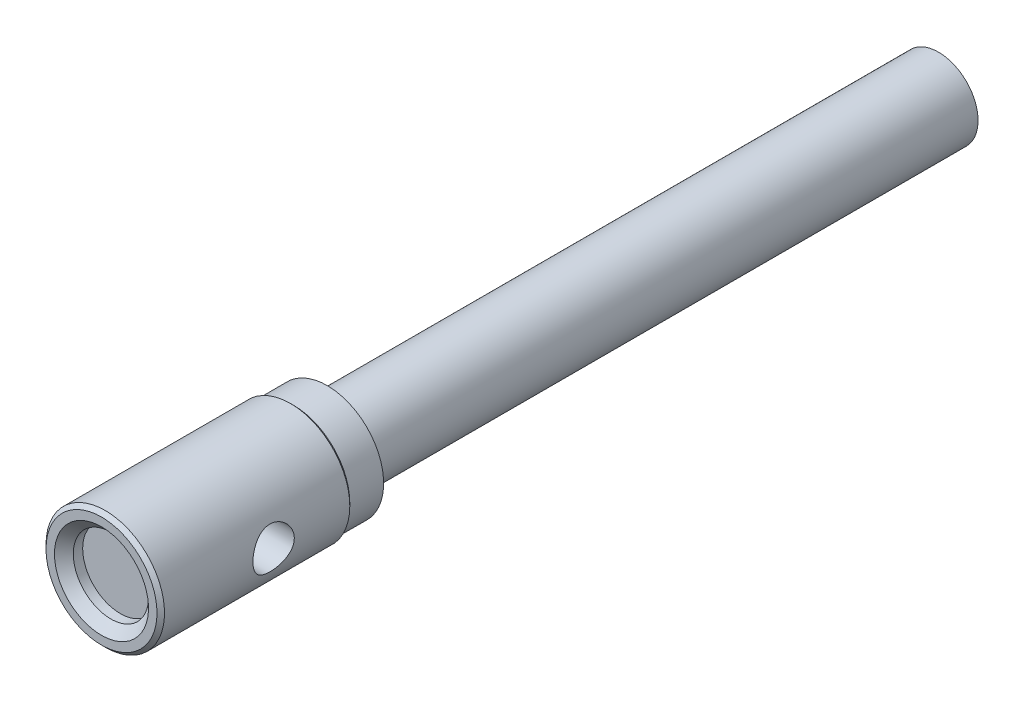
ISO-10303-21;
HEADER;
FILE_DESCRIPTION(('STEP AP214'),'2;1');
FILE_NAME('part.step','',(''),(''),'','','');
FILE_SCHEMA(('AUTOMOTIVE_DESIGN { 1 0 10303 214 1 1 1 1 }'));
ENDSEC;
DATA;
#1=APPLICATION_CONTEXT('core data for automotive mechanical design processes');
#2=APPLICATION_PROTOCOL_DEFINITION('international standard','automotive_design',2000,#1);
#3=PRODUCT_CONTEXT('',#1,'mechanical');
#4=PRODUCT('Part','Part','',(#3));
#5=PRODUCT_RELATED_PRODUCT_CATEGORY('part','',(#4));
#6=PRODUCT_DEFINITION_FORMATION('','',#4);
#7=PRODUCT_DEFINITION_CONTEXT('part definition',#1,'design');
#8=PRODUCT_DEFINITION('design','',#6,#7);
#9=PRODUCT_DEFINITION_SHAPE('','',#8);
#10=(LENGTH_UNIT() NAMED_UNIT(*) SI_UNIT(.MILLI.,.METRE.));
#11=(NAMED_UNIT(*) PLANE_ANGLE_UNIT() SI_UNIT($,.RADIAN.));
#12=(NAMED_UNIT(*) SI_UNIT($,.STERADIAN.) SOLID_ANGLE_UNIT());
#13=UNCERTAINTY_MEASURE_WITH_UNIT(LENGTH_MEASURE(1.E-05),#10,'distance_accuracy_value','');
#14=(GEOMETRIC_REPRESENTATION_CONTEXT(3) GLOBAL_UNCERTAINTY_ASSIGNED_CONTEXT((#13)) GLOBAL_UNIT_ASSIGNED_CONTEXT((#10,
#11,#12)) REPRESENTATION_CONTEXT('',''));
#15=CARTESIAN_POINT('',(0.,0.,0.));
#16=DIRECTION('',(0.,0.,1.));
#17=DIRECTION('',(1.,0.,0.));
#18=AXIS2_PLACEMENT_3D('',#15,#16,#17);
#19=CARTESIAN_POINT('',(0.,0.,11.));
#20=DIRECTION('',(0.,0.,-1.));
#21=DIRECTION('',(-1.,0.,0.));
#22=AXIS2_PLACEMENT_3D('',#19,#20,#21);
#23=PLANE('',#22);
#24=CARTESIAN_POINT('',(0.,0.,11.));
#25=DIRECTION('',(0.,0.,-1.));
#26=DIRECTION('',(-1.,0.,0.));
#27=AXIS2_PLACEMENT_3D('',#24,#25,#26);
#28=CIRCLE('',#27,2.);
#29=CARTESIAN_POINT('',(-1.99999999999999,0.,11.));
#30=VERTEX_POINT('',#29);
#31=EDGE_CURVE('E131',#30,#30,#28,.T.);
#32=ORIENTED_EDGE('',*,*,#31,.F.);
#33=EDGE_LOOP('',(#32));
#34=FACE_BOUND('',#33,.T.);
#35=ADVANCED_FACE('F31',(#34),#23,.F.);
#36=CARTESIAN_POINT('',(2.1,0.,-32.5));
#37=DIRECTION('',(0.,0.,1.));
#38=DIRECTION('',(1.,0.,0.));
#39=AXIS2_PLACEMENT_3D('',#36,#37,#38);
#40=PLANE('',#39);
#41=CARTESIAN_POINT('',(0.,0.,-32.5));
#42=DIRECTION('',(0.,0.,-1.));
#43=DIRECTION('',(-1.,0.,0.));
#44=AXIS2_PLACEMENT_3D('',#41,#42,#43);
#45=CIRCLE('',#44,2.1);
#46=CARTESIAN_POINT('',(-2.1,0.,-32.5));
#47=VERTEX_POINT('',#46);
#48=EDGE_CURVE('E121',#47,#47,#45,.T.);
#49=ORIENTED_EDGE('',*,*,#48,.T.);
#50=EDGE_LOOP('',(#49));
#51=FACE_BOUND('',#50,.T.);
#52=ADVANCED_FACE('F91',(#51),#40,.F.);
#53=CARTESIAN_POINT('',(0.,0.,-32.5));
#54=DIRECTION('',(0.,0.,-1.));
#55=DIRECTION('',(-1.,0.,0.));
#56=AXIS2_PLACEMENT_3D('',#53,#54,#55);
#57=CYLINDRICAL_SURFACE('',#56,2.1);
#58=ORIENTED_EDGE('',*,*,#48,.F.);
#59=EDGE_LOOP('',(#58));
#60=FACE_BOUND('',#59,.T.);
#61=CARTESIAN_POINT('',(0.,0.,0.));
#62=DIRECTION('',(0.,0.,-1.));
#63=DIRECTION('',(-1.,0.,0.));
#64=AXIS2_PLACEMENT_3D('',#61,#62,#63);
#65=CIRCLE('',#64,2.1);
#66=CARTESIAN_POINT('',(-2.09999999999999,0.,0.));
#67=VERTEX_POINT('',#66);
#68=EDGE_CURVE('E123',#67,#67,#65,.T.);
#69=ORIENTED_EDGE('',*,*,#68,.T.);
#70=EDGE_LOOP('',(#69));
#71=FACE_BOUND('',#70,.T.);
#72=ADVANCED_FACE('F97',(#60,#71),#57,.T.);
#73=CARTESIAN_POINT('',(3.,0.,0.));
#74=DIRECTION('',(0.,0.,1.));
#75=DIRECTION('',(1.,0.,0.));
#76=AXIS2_PLACEMENT_3D('',#73,#74,#75);
#77=PLANE('',#76);
#78=ORIENTED_EDGE('',*,*,#68,.F.);
#79=EDGE_LOOP('',(#78));
#80=FACE_BOUND('',#79,.T.);
#81=CARTESIAN_POINT('',(0.,0.,0.));
#82=DIRECTION('',(0.,0.,-1.));
#83=DIRECTION('',(-1.,0.,0.));
#84=AXIS2_PLACEMENT_3D('',#81,#82,#83);
#85=CIRCLE('',#84,3.);
#86=CARTESIAN_POINT('',(-2.99999999999999,0.,0.));
#87=VERTEX_POINT('',#86);
#88=EDGE_CURVE('E126',#87,#87,#85,.T.);
#89=ORIENTED_EDGE('',*,*,#88,.T.);
#90=EDGE_LOOP('',(#89));
#91=FACE_BOUND('',#90,.T.);
#92=ADVANCED_FACE('F136',(#80,#91),#77,.F.);
#93=CARTESIAN_POINT('',(0.,0.,-32.5));
#94=DIRECTION('',(0.,0.,-1.));
#95=DIRECTION('',(-1.,0.,0.));
#96=AXIS2_PLACEMENT_3D('',#93,#94,#95);
#97=CYLINDRICAL_SURFACE('',#96,3.);
#98=CARTESIAN_POINT('',(0.,0.,1.8));
#99=DIRECTION('',(0.,0.,1.));
#100=DIRECTION('',(1.,0.,0.));
#101=AXIS2_PLACEMENT_3D('',#98,#99,#100);
#102=CIRCLE('',#101,3.);
#103=CARTESIAN_POINT('',(3.,0.,1.8));
#104=VERTEX_POINT('',#103);
#105=EDGE_CURVE('E38',#104,#104,#102,.F.);
#106=ORIENTED_EDGE('',*,*,#105,.T.);
#107=EDGE_LOOP('',(#106));
#108=FACE_BOUND('',#107,.T.);
#109=ORIENTED_EDGE('',*,*,#88,.F.);
#110=EDGE_LOOP('',(#109));
#111=FACE_BOUND('',#110,.T.);
#112=ADVANCED_FACE('F88',(#108,#111),#97,.T.);
#113=CARTESIAN_POINT('',(0.,0.,-32.5));
#114=DIRECTION('',(0.,0.,-1.));
#115=DIRECTION('',(-1.,0.,0.));
#116=AXIS2_PLACEMENT_3D('',#113,#114,#115);
#117=CYLINDRICAL_SURFACE('',#116,3.15);
#118=CARTESIAN_POINT('',(0.,0.,1.95));
#119=DIRECTION('',(0.,0.,1.));
#120=DIRECTION('',(1.,0.,0.));
#121=AXIS2_PLACEMENT_3D('',#118,#119,#120);
#122=CIRCLE('',#121,3.15);
#123=CARTESIAN_POINT('',(3.15,0.,1.95));
#124=VERTEX_POINT('',#123);
#125=EDGE_CURVE('E10',#124,#124,#122,.T.);
#126=ORIENTED_EDGE('',*,*,#125,.T.);
#127=EDGE_LOOP('',(#126));
#128=FACE_BOUND('',#127,.T.);
#129=CARTESIAN_POINT('',(0.,0.,11.8));
#130=DIRECTION('',(0.,0.,-1.));
#131=DIRECTION('',(-1.,0.,0.));
#132=AXIS2_PLACEMENT_3D('',#129,#130,#131);
#133=CIRCLE('',#132,3.15);
#134=CARTESIAN_POINT('',(-3.14999999999999,0.,11.8));
#135=VERTEX_POINT('',#134);
#136=EDGE_CURVE('E46',#135,#135,#133,.T.);
#137=ORIENTED_EDGE('',*,*,#136,.T.);
#138=EDGE_LOOP('',(#137));
#139=FACE_BOUND('',#138,.T.);
#140=CARTESIAN_POINT('',(-3.14999999999999,0.,4.9));
#141=CARTESIAN_POINT('',(-3.15000062656625,0.0598545161133453,4.89999910423972));
#142=CARTESIAN_POINT('',(-3.14827860290213,0.119702639683627,4.90490100252035));
#143=CARTESIAN_POINT('',(-3.14157958504155,0.237626306593505,4.92431203783043));
#144=CARTESIAN_POINT('',(-3.13660256089176,0.295701833616074,4.93882126326893));
#145=CARTESIAN_POINT('',(-3.12393195053776,0.408363240048861,4.97688212223573));
#146=CARTESIAN_POINT('',(-3.11624316965986,0.462955091869647,5.0004177670456));
#147=CARTESIAN_POINT('',(-3.09892673820325,0.567415238871868,5.05578775244425));
#148=CARTESIAN_POINT('',(-3.08929864969265,0.617282463397579,5.08762396793591));
#149=CARTESIAN_POINT('',(-3.06870531573153,0.712751350462781,5.15994513875445));
#150=CARTESIAN_POINT('',(-3.05770582603618,0.758151333451825,5.2006865038018));
#151=CARTESIAN_POINT('',(-3.03579023232722,0.841631710777947,5.28911675006506));
#152=CARTESIAN_POINT('',(-3.02487414981114,0.87971027538392,5.33680736277993));
#153=CARTESIAN_POINT('',(-3.00397673772314,0.948665640724425,5.43965464143032));
#154=CARTESIAN_POINT('',(-2.99403667193371,0.979271968310073,5.49500185417965));
#155=CARTESIAN_POINT('',(-2.97674190512394,1.03065419586177,5.61046093760303));
#156=CARTESIAN_POINT('',(-2.96938632680995,1.05143343242372,5.67057118297784));
#157=CARTESIAN_POINT('',(-2.95845594752781,1.0818002935028,5.79154473877334));
#158=CARTESIAN_POINT('',(-2.95475299257686,1.09176859474416,5.85230055162693));
#159=CARTESIAN_POINT('',(-2.95116942479476,1.10142095433558,5.97472660729035));
#160=CARTESIAN_POINT('',(-2.95128749105079,1.10110856668092,6.03639652672798));
#161=CARTESIAN_POINT('',(-2.95522098002829,1.090502302001,6.15557021187301));
#162=CARTESIAN_POINT('',(-2.95884829617291,1.08071622649996,6.21312648380761));
#163=CARTESIAN_POINT('',(-2.96908200122875,1.0522728492418,6.3257219207364));
#164=CARTESIAN_POINT('',(-2.97568877972427,1.03361438734442,6.38076075552221));
#165=CARTESIAN_POINT('',(-2.99126318398664,0.987643714746534,6.48786846010328));
#166=CARTESIAN_POINT('',(-3.00026948896013,0.960188077408949,6.53986990183929));
#167=CARTESIAN_POINT('',(-3.0196131785397,0.897502065832835,6.63868316573245));
#168=CARTESIAN_POINT('',(-3.02995097638792,0.86226927544358,6.68549336830731));
#169=CARTESIAN_POINT('',(-3.05152104436138,0.782632851617404,6.77543380555815));
#170=CARTESIAN_POINT('',(-3.06277051978743,0.737817562456753,6.81819622008191));
#171=CARTESIAN_POINT('',(-3.08437832435996,0.64151600388609,6.89569960896031));
#172=CARTESIAN_POINT('',(-3.09473655045202,0.590028964747469,6.93043965647527));
#173=CARTESIAN_POINT('',(-3.11355477418329,0.481007517863014,6.99124745241965));
#174=CARTESIAN_POINT('',(-3.12199089830337,0.4234088477472,7.01720788811906));
#175=CARTESIAN_POINT('',(-3.13583989764418,0.304295581027896,7.05895353796206));
#176=CARTESIAN_POINT('',(-3.14125393003361,0.242782493332131,7.07474264709682));
#177=CARTESIAN_POINT('',(-3.14825269486376,0.120693730416341,7.09502550652171));
#178=CARTESIAN_POINT('',(-3.15000556518867,0.0602100549662604,7.10001561625123));
#179=CARTESIAN_POINT('',(-3.1499944119144,-0.0607479662730148,7.09998431812019));
#180=CARTESIAN_POINT('',(-3.14823104839565,-0.121222311682388,7.09496478930605));
#181=CARTESIAN_POINT('',(-3.14149668523958,-0.238400354931432,7.07544420728632));
#182=CARTESIAN_POINT('',(-3.13663136424965,-0.295162742601184,7.06125532993516));
#183=CARTESIAN_POINT('',(-3.12428791644542,-0.405472513213696,7.02419671666653));
#184=CARTESIAN_POINT('',(-3.11680945172395,-0.459019479318499,7.00132585804384));
#185=CARTESIAN_POINT('',(-3.09973442016246,-0.563029674755728,6.94685742880978));
#186=CARTESIAN_POINT('',(-3.09008506774048,-0.613366922398644,6.91503632343342));
#187=CARTESIAN_POINT('',(-3.06975327042955,-0.70814420139711,6.84382931987137));
#188=CARTESIAN_POINT('',(-3.05907048438502,-0.752582273761962,6.80444091932127));
#189=CARTESIAN_POINT('',(-3.03719376097003,-0.836620969871215,6.71688802043494));
#190=CARTESIAN_POINT('',(-3.02600102513227,-0.875867758663472,6.66838273671123));
#191=CARTESIAN_POINT('',(-3.00490480670685,-0.945718047111593,6.5652400387616));
#192=CARTESIAN_POINT('',(-2.99500136750512,-0.976321255944126,6.51060241829247));
#193=CARTESIAN_POINT('',(-2.97768561084442,-1.02792679703435,6.39658540267257));
#194=CARTESIAN_POINT('',(-2.97027307046783,-1.04892998848553,6.33720643242761));
#195=CARTESIAN_POINT('',(-2.95892652729931,-1.08052818769068,6.21543077257845));
#196=CARTESIAN_POINT('',(-2.95499075059248,-1.09112850350811,6.15303563904198));
#197=CARTESIAN_POINT('',(-2.95125796496875,-1.10118223019238,6.03077416838599));
#198=CARTESIAN_POINT('',(-2.95124074917837,-1.10122872179722,5.97096283156171));
#199=CARTESIAN_POINT('',(-2.95479511846875,-1.09165529933772,5.85223312453418));
#200=CARTESIAN_POINT('',(-2.95836644798005,-1.08203607364767,5.79331469104333));
#201=CARTESIAN_POINT('',(-2.96852404653166,-1.05384065152559,5.67939757509265));
#202=CARTESIAN_POINT('',(-2.97503937024913,-1.03547470392346,5.62434001608752));
#203=CARTESIAN_POINT('',(-2.99031875450277,-0.990482463449925,5.51804844197044));
#204=CARTESIAN_POINT('',(-2.9990833427798,-0.96385423170683,5.46681532782765));
#205=CARTESIAN_POINT('',(-3.01838743083872,-0.901634293925672,5.36701149889824));
#206=CARTESIAN_POINT('',(-3.02899103546646,-0.865679820732345,5.31867944479558));
#207=CARTESIAN_POINT('',(-3.05052869673277,-0.786421817964849,5.22854384267475));
#208=CARTESIAN_POINT('',(-3.06146285028218,-0.743116115630232,5.18674223185694));
#209=CARTESIAN_POINT('',(-3.08301179853969,-0.648083142472834,5.10897740575008));
#210=CARTESIAN_POINT('',(-3.09359093951059,-0.596067612540762,5.0733552219445));
#211=CARTESIAN_POINT('',(-3.1127125057939,-0.486428367368266,5.01138958513266));
#212=CARTESIAN_POINT('',(-3.12125521333987,-0.428805430830662,4.98504484610417));
#213=CARTESIAN_POINT('',(-3.13523967981924,-0.310296928997333,4.94282379630589));
#214=CARTESIAN_POINT('',(-3.14071886710978,-0.249461152258471,4.92682074213998));
#215=CARTESIAN_POINT('',(-3.14809807501834,-0.125747420152497,4.90541115924654));
#216=CARTESIAN_POINT('',(-3.14999934186527,-0.0628701836137011,4.90000094089163));
#217=CARTESIAN_POINT('',(-3.14999999999999,0.,4.9));
#218=B_SPLINE_CURVE_WITH_KNOTS('',3,(#140,#141,#142,#143,#144,#145,#146,#147,#148,#149,#150,
#151,#152,#153,#154,#155,#156,#157,#158,#159,#160,#161,#162,#163,#164,#165,#166,#167,#168,#169,
#170,#171,#172,#173,#174,#175,#176,#177,#178,#179,#180,#181,#182,#183,#184,#185,#186,#187,#188,
#189,#190,#191,#192,#193,#194,#195,#196,#197,#198,#199,#200,#201,#202,#203,#204,#205,#206,#207,
#208,#209,#210,#211,#212,#213,#214,#215,#216,#217),.UNSPECIFIED.,.T.,.F.,(4,2,2,2,2,2,2,2,2,2,2,
2,2,2,2,2,2,2,2,2,2,2,2,2,2,2,2,2,2,2,2,2,2,2,2,2,2,2,4),(0.,0.179331982868924,
0.358665616019064,0.537683047375237,0.716740949624888,0.901863506430727,1.08703226814633,
1.27814609872312,1.46919499368056,1.6532732495753,1.83728787098142,2.01195573119549,
2.18664643700608,2.36434404870121,2.5420969441235,2.73009915891897,2.91812308312213,
3.10836851011476,3.29854104145991,3.47976856850465,3.66096207804949,3.83629036546456,
4.01164133307993,4.19183432776892,4.37208701182706,4.56136916730426,4.75065769064192,
4.9399292694969,5.12910422230741,5.30764554483329,5.48617415288157,5.66061275020245,
5.83509231321367,6.01778067151487,6.20052312027806,6.39136786323447,6.58218614122296,
6.77061910498604,6.95898642332553),.UNSPECIFIED.);
#219=CARTESIAN_POINT('',(-3.14999999999999,0.,4.9));
#220=VERTEX_POINT('',#219);
#221=EDGE_CURVE('E57',#220,#220,#218,.T.);
#222=ORIENTED_EDGE('',*,*,#221,.T.);
#223=EDGE_LOOP('',(#222));
#224=FACE_BOUND('',#223,.T.);
#225=CARTESIAN_POINT('',(3.15,0.,4.9));
#226=CARTESIAN_POINT('',(3.15000062656626,-0.0598545161133453,4.89999910423972));
#227=CARTESIAN_POINT('',(3.14827860290214,-0.119702639683627,4.90490100252035));
#228=CARTESIAN_POINT('',(3.14157958504156,-0.237626306593505,4.92431203783043));
#229=CARTESIAN_POINT('',(3.13660256089177,-0.295701833616074,4.93882126326893));
#230=CARTESIAN_POINT('',(3.12393195053777,-0.408363240048861,4.97688212223573));
#231=CARTESIAN_POINT('',(3.11624316965987,-0.462955091869647,5.0004177670456));
#232=CARTESIAN_POINT('',(3.09892673820326,-0.567415238871868,5.05578775244425));
#233=CARTESIAN_POINT('',(3.08929864969266,-0.617282463397579,5.08762396793591));
#234=CARTESIAN_POINT('',(3.06870531573154,-0.712751350462781,5.15994513875445));
#235=CARTESIAN_POINT('',(3.05770582603619,-0.758151333451825,5.2006865038018));
#236=CARTESIAN_POINT('',(3.03579023232723,-0.841631710777947,5.28911675006506));
#237=CARTESIAN_POINT('',(3.02487414981115,-0.87971027538392,5.33680736277993));
#238=CARTESIAN_POINT('',(3.00397673772315,-0.948665640724425,5.43965464143032));
#239=CARTESIAN_POINT('',(2.99403667193372,-0.979271968310073,5.49500185417965));
#240=CARTESIAN_POINT('',(2.97674190512395,-1.03065419586177,5.61046093760303));
#241=CARTESIAN_POINT('',(2.96938632680996,-1.05143343242372,5.67057118297784));
#242=CARTESIAN_POINT('',(2.95845594752782,-1.0818002935028,5.79154473877334));
#243=CARTESIAN_POINT('',(2.95475299257687,-1.09176859474416,5.85230055162693));
#244=CARTESIAN_POINT('',(2.95116942479477,-1.10142095433558,5.97472660729035));
#245=CARTESIAN_POINT('',(2.9512874910508,-1.10110856668092,6.03639652672798));
#246=CARTESIAN_POINT('',(2.9552209800283,-1.090502302001,6.15557021187301));
#247=CARTESIAN_POINT('',(2.95884829617292,-1.08071622649997,6.21312648380761));
#248=CARTESIAN_POINT('',(2.96908200122876,-1.0522728492418,6.3257219207364));
#249=CARTESIAN_POINT('',(2.97568877972428,-1.03361438734442,6.38076075552221));
#250=CARTESIAN_POINT('',(2.99126318398665,-0.987643714746534,6.48786846010328));
#251=CARTESIAN_POINT('',(3.00026948896013,-0.96018807740895,6.53986990183929));
#252=CARTESIAN_POINT('',(3.01961317853971,-0.897502065832836,6.63868316573245));
#253=CARTESIAN_POINT('',(3.02995097638793,-0.862269275443581,6.68549336830731));
#254=CARTESIAN_POINT('',(3.05152104436138,-0.782632851617404,6.77543380555815));
#255=CARTESIAN_POINT('',(3.06277051978744,-0.737817562456752,6.81819622008191));
#256=CARTESIAN_POINT('',(3.08437832435997,-0.64151600388609,6.89569960896031));
#257=CARTESIAN_POINT('',(3.09473655045203,-0.590028964747469,6.93043965647527));
#258=CARTESIAN_POINT('',(3.1135547741833,-0.481007517863014,6.99124745241965));
#259=CARTESIAN_POINT('',(3.12199089830338,-0.4234088477472,7.01720788811906));
#260=CARTESIAN_POINT('',(3.13583989764419,-0.304295581027896,7.05895353796206));
#261=CARTESIAN_POINT('',(3.14125393003362,-0.242782493332131,7.07474264709682));
#262=CARTESIAN_POINT('',(3.14825269486377,-0.120693730416341,7.09502550652171));
#263=CARTESIAN_POINT('',(3.15000556518868,-0.0602100549662607,7.10001561625123));
#264=CARTESIAN_POINT('',(3.14999441191441,0.0607479662730145,7.09998431812019));
#265=CARTESIAN_POINT('',(3.14823104839566,0.121222311682388,7.09496478930605));
#266=CARTESIAN_POINT('',(3.14149668523959,0.238400354931432,7.07544420728632));
#267=CARTESIAN_POINT('',(3.13663136424966,0.295162742601184,7.06125532993516));
#268=CARTESIAN_POINT('',(3.12428791644543,0.405472513213695,7.02419671666653));
#269=CARTESIAN_POINT('',(3.11680945172396,0.459019479318499,7.00132585804384));
#270=CARTESIAN_POINT('',(3.09973442016247,0.563029674755727,6.94685742880978));
#271=CARTESIAN_POINT('',(3.09008506774048,0.613366922398643,6.91503632343343));
#272=CARTESIAN_POINT('',(3.06975327042956,0.708144201397109,6.84382931987137));
#273=CARTESIAN_POINT('',(3.05907048438503,0.752582273761962,6.80444091932127));
#274=CARTESIAN_POINT('',(3.03719376097003,0.836620969871215,6.71688802043494));
#275=CARTESIAN_POINT('',(3.02600102513228,0.875867758663472,6.66838273671123));
#276=CARTESIAN_POINT('',(3.00490480670685,0.945718047111593,6.5652400387616));
#277=CARTESIAN_POINT('',(2.99500136750512,0.976321255944126,6.51060241829247));
#278=CARTESIAN_POINT('',(2.97768561084442,1.02792679703435,6.39658540267257));
#279=CARTESIAN_POINT('',(2.97027307046783,1.04892998848553,6.33720643242761));
#280=CARTESIAN_POINT('',(2.95892652729932,1.08052818769068,6.21543077257845));
#281=CARTESIAN_POINT('',(2.95499075059249,1.09112850350811,6.15303563904198));
#282=CARTESIAN_POINT('',(2.95125796496876,1.10118223019238,6.03077416838599));
#283=CARTESIAN_POINT('',(2.95124074917838,1.10122872179722,5.97096283156172));
#284=CARTESIAN_POINT('',(2.95479511846876,1.09165529933772,5.85223312453418));
#285=CARTESIAN_POINT('',(2.95836644798006,1.08203607364767,5.79331469104333));
#286=CARTESIAN_POINT('',(2.96852404653167,1.05384065152559,5.67939757509265));
#287=CARTESIAN_POINT('',(2.97503937024914,1.03547470392346,5.62434001608752));
#288=CARTESIAN_POINT('',(2.99031875450278,0.990482463449925,5.51804844197044));
#289=CARTESIAN_POINT('',(2.99908334277981,0.96385423170683,5.46681532782765));
#290=CARTESIAN_POINT('',(3.01838743083872,0.901634293925672,5.36701149889823));
#291=CARTESIAN_POINT('',(3.02899103546647,0.865679820732344,5.31867944479558));
#292=CARTESIAN_POINT('',(3.05052869673278,0.786421817964848,5.22854384267475));
#293=CARTESIAN_POINT('',(3.06146285028219,0.743116115630232,5.18674223185694));
#294=CARTESIAN_POINT('',(3.0830117985397,0.648083142472834,5.10897740575008));
#295=CARTESIAN_POINT('',(3.0935909395106,0.596067612540763,5.0733552219445));
#296=CARTESIAN_POINT('',(3.11271250579391,0.486428367368267,5.01138958513266));
#297=CARTESIAN_POINT('',(3.12125521333988,0.428805430830663,4.98504484610417));
#298=CARTESIAN_POINT('',(3.13523967981925,0.310296928997334,4.94282379630589));
#299=CARTESIAN_POINT('',(3.14071886710979,0.249461152258472,4.92682074213998));
#300=CARTESIAN_POINT('',(3.14809807501835,0.125747420152498,4.90541115924654));
#301=CARTESIAN_POINT('',(3.14999934186527,0.0628701836137014,4.90000094089163));
#302=CARTESIAN_POINT('',(3.15,0.,4.9));
#303=B_SPLINE_CURVE_WITH_KNOTS('',3,(#225,#226,#227,#228,#229,#230,#231,#232,#233,#234,#235,
#236,#237,#238,#239,#240,#241,#242,#243,#244,#245,#246,#247,#248,#249,#250,#251,#252,#253,#254,
#255,#256,#257,#258,#259,#260,#261,#262,#263,#264,#265,#266,#267,#268,#269,#270,#271,#272,#273,
#274,#275,#276,#277,#278,#279,#280,#281,#282,#283,#284,#285,#286,#287,#288,#289,#290,#291,#292,
#293,#294,#295,#296,#297,#298,#299,#300,#301,#302),.UNSPECIFIED.,.T.,.F.,(4,2,2,2,2,2,2,2,2,2,2,
2,2,2,2,2,2,2,2,2,2,2,2,2,2,2,2,2,2,2,2,2,2,2,2,2,2,2,4),(0.,0.179331982868924,
0.358665616019064,0.537683047375237,0.716740949624888,0.901863506430727,1.08703226814633,
1.27814609872312,1.46919499368056,1.6532732495753,1.83728787098142,2.01195573119549,
2.18664643700609,2.36434404870121,2.54209694412351,2.73009915891897,2.91812308312213,
3.10836851011476,3.29854104145991,3.47976856850465,3.66096207804949,3.83629036546456,
4.01164133307993,4.19183432776892,4.37208701182706,4.56136916730426,4.75065769064192,
4.9399292694969,5.12910422230741,5.30764554483329,5.48617415288157,5.66061275020245,
5.83509231321367,6.01778067151488,6.20052312027806,6.39136786323447,6.58218614122296,
6.77061910498604,6.95898642332553),.UNSPECIFIED.);
#304=CARTESIAN_POINT('',(3.15,0.,4.9));
#305=VERTEX_POINT('',#304);
#306=EDGE_CURVE('E64',#305,#305,#303,.T.);
#307=ORIENTED_EDGE('',*,*,#306,.T.);
#308=EDGE_LOOP('',(#307));
#309=FACE_BOUND('',#308,.T.);
#310=ADVANCED_FACE('F68',(#128,#139,#224,#309),#117,.T.);
#311=CARTESIAN_POINT('',(2.,0.,12.));
#312=DIRECTION('',(0.,0.,-1.));
#313=DIRECTION('',(-1.,0.,0.));
#314=AXIS2_PLACEMENT_3D('',#311,#312,#313);
#315=PLANE('',#314);
#316=CARTESIAN_POINT('',(0.,0.,12.));
#317=DIRECTION('',(0.,0.,-1.));
#318=DIRECTION('',(-1.,0.,0.));
#319=AXIS2_PLACEMENT_3D('',#316,#317,#318);
#320=CIRCLE('',#319,2.94999999999998);
#321=CARTESIAN_POINT('',(-2.94999999999998,0.,12.));
#322=VERTEX_POINT('',#321);
#323=EDGE_CURVE('E42',#322,#322,#320,.F.);
#324=ORIENTED_EDGE('',*,*,#323,.T.);
#325=EDGE_LOOP('',(#324));
#326=FACE_BOUND('',#325,.T.);
#327=CARTESIAN_POINT('',(0.,0.,12.));
#328=DIRECTION('',(0.,0.,-1.));
#329=DIRECTION('',(-1.,0.,0.));
#330=AXIS2_PLACEMENT_3D('',#327,#328,#329);
#331=CIRCLE('',#330,2.5);
#332=CARTESIAN_POINT('',(-2.5,0.,12.));
#333=VERTEX_POINT('',#332);
#334=EDGE_CURVE('E54',#333,#333,#331,.T.);
#335=ORIENTED_EDGE('',*,*,#334,.T.);
#336=EDGE_LOOP('',(#335));
#337=FACE_BOUND('',#336,.T.);
#338=ADVANCED_FACE('F81',(#326,#337),#315,.F.);
#339=CARTESIAN_POINT('',(0.,0.,-32.5));
#340=DIRECTION('',(0.,0.,-1.));
#341=DIRECTION('',(-1.,0.,0.));
#342=AXIS2_PLACEMENT_3D('',#339,#340,#341);
#343=CYLINDRICAL_SURFACE('',#342,2.);
#344=CARTESIAN_POINT('',(0.,0.,11.5));
#345=DIRECTION('',(0.,0.,-1.));
#346=DIRECTION('',(-1.,0.,0.));
#347=AXIS2_PLACEMENT_3D('',#344,#345,#346);
#348=CIRCLE('',#347,2.);
#349=CARTESIAN_POINT('',(-1.99999999999999,0.,11.5));
#350=VERTEX_POINT('',#349);
#351=EDGE_CURVE('E51',#350,#350,#348,.F.);
#352=ORIENTED_EDGE('',*,*,#351,.T.);
#353=EDGE_LOOP('',(#352));
#354=FACE_BOUND('',#353,.T.);
#355=ORIENTED_EDGE('',*,*,#31,.T.);
#356=EDGE_LOOP('',(#355));
#357=FACE_BOUND('',#356,.T.);
#358=ADVANCED_FACE('F77',(#354,#357),#343,.F.);
#359=CARTESIAN_POINT('',(-3.14999999999999,0.,6.));
#360=DIRECTION('',(1.,0.,0.));
#361=DIRECTION('',(0.,0.,-1.));
#362=AXIS2_PLACEMENT_3D('',#359,#360,#361);
#363=CYLINDRICAL_SURFACE('',#362,1.1);
#364=ORIENTED_EDGE('',*,*,#306,.F.);
#365=EDGE_LOOP('',(#364));
#366=FACE_BOUND('',#365,.T.);
#367=ORIENTED_EDGE('',*,*,#221,.F.);
#368=EDGE_LOOP('',(#367));
#369=FACE_BOUND('',#368,.T.);
#370=ADVANCED_FACE('F72',(#366,#369),#363,.F.);
#371=CARTESIAN_POINT('',(0.,0.,12.));
#372=DIRECTION('',(0.,0.,1.));
#373=DIRECTION('',(1.,0.,0.));
#374=AXIS2_PLACEMENT_3D('',#371,#372,#373);
#375=CONICAL_SURFACE('',#374,2.5,0.785398163397453);
#376=ORIENTED_EDGE('',*,*,#351,.F.);
#377=EDGE_LOOP('',(#376));
#378=FACE_BOUND('',#377,.T.);
#379=ORIENTED_EDGE('',*,*,#334,.F.);
#380=EDGE_LOOP('',(#379));
#381=FACE_BOUND('',#380,.T.);
#382=ADVANCED_FACE('F76',(#378,#381),#375,.F.);
#383=CARTESIAN_POINT('',(0.,0.,11.8));
#384=DIRECTION('',(0.,0.,-1.));
#385=DIRECTION('',(-1.,0.,0.));
#386=AXIS2_PLACEMENT_3D('',#383,#384,#385);
#387=CONICAL_SURFACE('',#386,3.15,0.785398163397456);
#388=ORIENTED_EDGE('',*,*,#323,.F.);
#389=EDGE_LOOP('',(#388));
#390=FACE_BOUND('',#389,.T.);
#391=ORIENTED_EDGE('',*,*,#136,.F.);
#392=EDGE_LOOP('',(#391));
#393=FACE_BOUND('',#392,.T.);
#394=ADVANCED_FACE('F104',(#390,#393),#387,.T.);
#395=CARTESIAN_POINT('',(0.,0.,1.8));
#396=DIRECTION('',(0.,0.,1.));
#397=DIRECTION('',(1.,0.,0.));
#398=AXIS2_PLACEMENT_3D('',#395,#396,#397);
#399=CONICAL_SURFACE('',#398,3.,0.785398163397438);
#400=ORIENTED_EDGE('',*,*,#125,.F.);
#401=EDGE_LOOP('',(#400));
#402=FACE_BOUND('',#401,.T.);
#403=ORIENTED_EDGE('',*,*,#105,.F.);
#404=EDGE_LOOP('',(#403));
#405=FACE_BOUND('',#404,.T.);
#406=ADVANCED_FACE('F33',(#402,#405),#399,.T.);
#407=CLOSED_SHELL('',(#35,#52,#72,#92,#112,#310,#338,#358,#370,#382,#394,#406));
#408=MANIFOLD_SOLID_BREP('B2',#407);
#409=ADVANCED_BREP_SHAPE_REPRESENTATION('',(#18,#408),#14);
#410=SHAPE_DEFINITION_REPRESENTATION(#9,#409);
ENDSEC;
END-ISO-10303-21;
